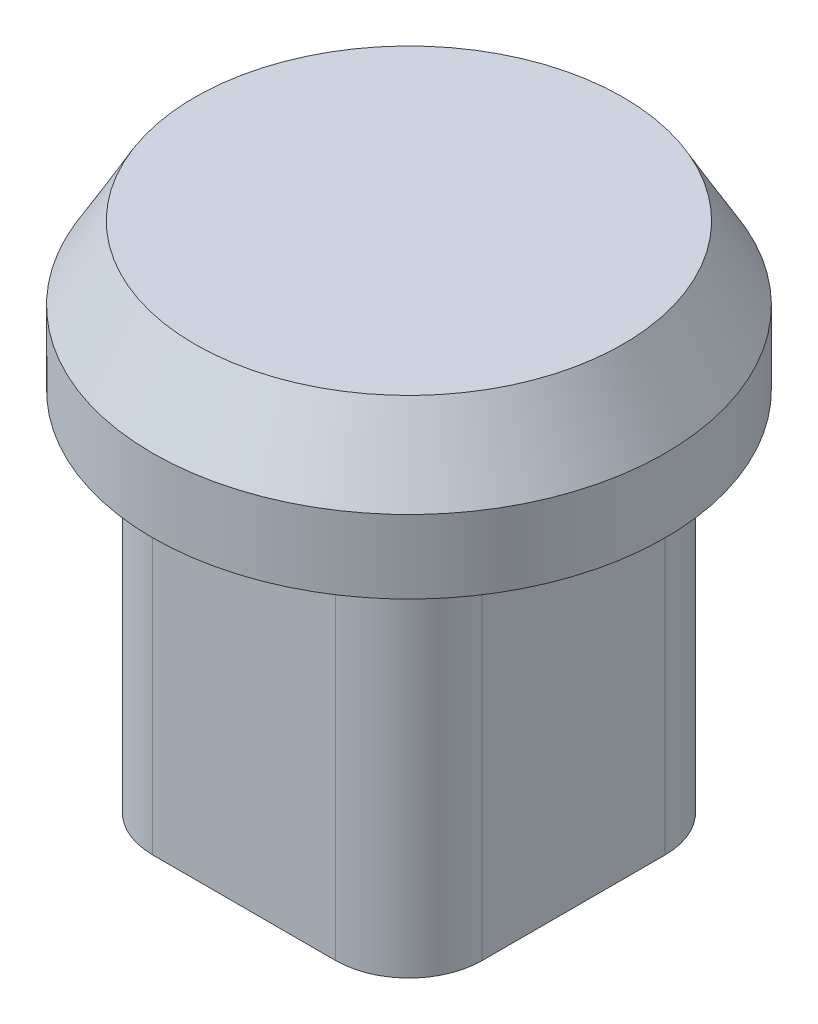
ISO-10303-21;
HEADER;
FILE_DESCRIPTION(('STEP AP214'),'2;1');
FILE_NAME('part.step','',(''),(''),'','','');
FILE_SCHEMA(('AUTOMOTIVE_DESIGN { 1 0 10303 214 1 1 1 1 }'));
ENDSEC;
DATA;
#1=APPLICATION_CONTEXT('core data for automotive mechanical design processes');
#2=APPLICATION_PROTOCOL_DEFINITION('international standard','automotive_design',2000,#1);
#3=PRODUCT_CONTEXT('',#1,'mechanical');
#4=PRODUCT('Part','Part','',(#3));
#5=PRODUCT_RELATED_PRODUCT_CATEGORY('part','',(#4));
#6=PRODUCT_DEFINITION_FORMATION('','',#4);
#7=PRODUCT_DEFINITION_CONTEXT('part definition',#1,'design');
#8=PRODUCT_DEFINITION('design','',#6,#7);
#9=PRODUCT_DEFINITION_SHAPE('','',#8);
#10=(LENGTH_UNIT() NAMED_UNIT(*) SI_UNIT(.MILLI.,.METRE.));
#11=(NAMED_UNIT(*) PLANE_ANGLE_UNIT() SI_UNIT($,.RADIAN.));
#12=(NAMED_UNIT(*) SI_UNIT($,.STERADIAN.) SOLID_ANGLE_UNIT());
#13=UNCERTAINTY_MEASURE_WITH_UNIT(LENGTH_MEASURE(1.E-05),#10,'distance_accuracy_value','');
#14=(GEOMETRIC_REPRESENTATION_CONTEXT(3) GLOBAL_UNCERTAINTY_ASSIGNED_CONTEXT((#13)) GLOBAL_UNIT_ASSIGNED_CONTEXT((#10,
#11,#12)) REPRESENTATION_CONTEXT('',''));
#15=CARTESIAN_POINT('',(0.,0.,0.));
#16=DIRECTION('',(0.,0.,1.));
#17=DIRECTION('',(1.,0.,0.));
#18=AXIS2_PLACEMENT_3D('',#15,#16,#17);
#19=CARTESIAN_POINT('',(2.25,5.,2.25));
#20=DIRECTION('',(-1.,0.,0.));
#21=DIRECTION('',(0.,0.,1.));
#22=AXIS2_PLACEMENT_3D('',#19,#20,#21);
#23=PLANE('',#22);
#24=DIRECTION('',(0.,0.,-1.));
#25=VECTOR('',#24,1.);
#26=CARTESIAN_POINT('',(2.25,0.,2.25));
#27=LINE('',#26,#25);
#28=CARTESIAN_POINT('',(2.25,0.,1.25));
#29=VERTEX_POINT('',#28);
#30=CARTESIAN_POINT('',(2.25,0.,-1.25));
#31=VERTEX_POINT('',#30);
#32=EDGE_CURVE('E127',#29,#31,#27,.T.);
#33=ORIENTED_EDGE('',*,*,#32,.T.);
#34=DIRECTION('',(0.,-1.,0.));
#35=VECTOR('',#34,1.);
#36=CARTESIAN_POINT('',(2.25,5.,-1.25));
#37=LINE('',#36,#35);
#38=CARTESIAN_POINT('',(2.25,5.,-1.25));
#39=VERTEX_POINT('',#38);
#40=EDGE_CURVE('E105',#31,#39,#37,.F.);
#41=ORIENTED_EDGE('',*,*,#40,.T.);
#42=DIRECTION('',(0.,0.,-1.));
#43=VECTOR('',#42,1.);
#44=CARTESIAN_POINT('',(2.25,5.,2.25));
#45=LINE('',#44,#43);
#46=CARTESIAN_POINT('',(2.25,5.,1.25));
#47=VERTEX_POINT('',#46);
#48=EDGE_CURVE('E137',#47,#39,#45,.T.);
#49=ORIENTED_EDGE('',*,*,#48,.F.);
#50=DIRECTION('',(0.,-1.,0.));
#51=VECTOR('',#50,1.);
#52=CARTESIAN_POINT('',(2.25,5.,1.25));
#53=LINE('',#52,#51);
#54=EDGE_CURVE('E110',#47,#29,#53,.T.);
#55=ORIENTED_EDGE('',*,*,#54,.T.);
#56=EDGE_LOOP('',(#33,#41,#49,#55));
#57=FACE_BOUND('',#56,.T.);
#58=ADVANCED_FACE('F35',(#57),#23,.F.);
#59=CARTESIAN_POINT('',(-2.25,5.,-2.25));
#60=DIRECTION('',(0.,0.,1.));
#61=DIRECTION('',(1.,0.,0.));
#62=AXIS2_PLACEMENT_3D('',#59,#60,#61);
#63=PLANE('',#62);
#64=DIRECTION('',(-1.,0.,0.));
#65=VECTOR('',#64,1.);
#66=CARTESIAN_POINT('',(-2.25,5.,-2.25));
#67=LINE('',#66,#65);
#68=CARTESIAN_POINT('',(1.25,5.,-2.25));
#69=VERTEX_POINT('',#68);
#70=CARTESIAN_POINT('',(-1.25,5.,-2.25));
#71=VERTEX_POINT('',#70);
#72=EDGE_CURVE('E119',#69,#71,#67,.T.);
#73=ORIENTED_EDGE('',*,*,#72,.F.);
#74=DIRECTION('',(0.,-1.,0.));
#75=VECTOR('',#74,1.);
#76=CARTESIAN_POINT('',(1.25,5.,-2.25));
#77=LINE('',#76,#75);
#78=CARTESIAN_POINT('',(1.25,0.,-2.25));
#79=VERTEX_POINT('',#78);
#80=EDGE_CURVE('E104',#69,#79,#77,.T.);
#81=ORIENTED_EDGE('',*,*,#80,.T.);
#82=DIRECTION('',(-1.,0.,0.));
#83=VECTOR('',#82,1.);
#84=CARTESIAN_POINT('',(-2.25,0.,-2.25));
#85=LINE('',#84,#83);
#86=CARTESIAN_POINT('',(-1.25,0.,-2.25));
#87=VERTEX_POINT('',#86);
#88=EDGE_CURVE('E117',#79,#87,#85,.T.);
#89=ORIENTED_EDGE('',*,*,#88,.T.);
#90=DIRECTION('',(0.,-1.,0.));
#91=VECTOR('',#90,1.);
#92=CARTESIAN_POINT('',(-1.25,5.,-2.25));
#93=LINE('',#92,#91);
#94=EDGE_CURVE('E121',#87,#71,#93,.F.);
#95=ORIENTED_EDGE('',*,*,#94,.T.);
#96=EDGE_LOOP('',(#73,#81,#89,#95));
#97=FACE_BOUND('',#96,.T.);
#98=ADVANCED_FACE('F116',(#97),#63,.F.);
#99=CARTESIAN_POINT('',(-2.25,5.,2.25));
#100=DIRECTION('',(1.,0.,0.));
#101=DIRECTION('',(0.,0.,-1.));
#102=AXIS2_PLACEMENT_3D('',#99,#100,#101);
#103=PLANE('',#102);
#104=DIRECTION('',(0.,0.,1.));
#105=VECTOR('',#104,1.);
#106=CARTESIAN_POINT('',(-2.25,5.,2.25));
#107=LINE('',#106,#105);
#108=CARTESIAN_POINT('',(-2.25,5.,-1.25));
#109=VERTEX_POINT('',#108);
#110=CARTESIAN_POINT('',(-2.25,5.,1.25));
#111=VERTEX_POINT('',#110);
#112=EDGE_CURVE('E184',#109,#111,#107,.T.);
#113=ORIENTED_EDGE('',*,*,#112,.F.);
#114=DIRECTION('',(0.,-1.,0.));
#115=VECTOR('',#114,1.);
#116=CARTESIAN_POINT('',(-2.25,5.,-1.25));
#117=LINE('',#116,#115);
#118=CARTESIAN_POINT('',(-2.25,0.,-1.25));
#119=VERTEX_POINT('',#118);
#120=EDGE_CURVE('E158',#109,#119,#117,.T.);
#121=ORIENTED_EDGE('',*,*,#120,.T.);
#122=DIRECTION('',(0.,0.,1.));
#123=VECTOR('',#122,1.);
#124=CARTESIAN_POINT('',(-2.25,0.,2.25));
#125=LINE('',#124,#123);
#126=CARTESIAN_POINT('',(-2.25,0.,1.25));
#127=VERTEX_POINT('',#126);
#128=EDGE_CURVE('E126',#119,#127,#125,.T.);
#129=ORIENTED_EDGE('',*,*,#128,.T.);
#130=DIRECTION('',(0.,-1.,0.));
#131=VECTOR('',#130,1.);
#132=CARTESIAN_POINT('',(-2.25,5.,1.25));
#133=LINE('',#132,#131);
#134=EDGE_CURVE('E50',#127,#111,#133,.F.);
#135=ORIENTED_EDGE('',*,*,#134,.T.);
#136=EDGE_LOOP('',(#113,#121,#129,#135));
#137=FACE_BOUND('',#136,.T.);
#138=ADVANCED_FACE('F182',(#137),#103,.F.);
#139=CARTESIAN_POINT('',(-2.25,5.,2.25));
#140=DIRECTION('',(0.,0.,-1.));
#141=DIRECTION('',(-1.,0.,0.));
#142=AXIS2_PLACEMENT_3D('',#139,#140,#141);
#143=PLANE('',#142);
#144=DIRECTION('',(1.,0.,0.));
#145=VECTOR('',#144,1.);
#146=CARTESIAN_POINT('',(-2.25,0.,2.25));
#147=LINE('',#146,#145);
#148=CARTESIAN_POINT('',(-1.25,0.,2.25));
#149=VERTEX_POINT('',#148);
#150=CARTESIAN_POINT('',(1.25,0.,2.25));
#151=VERTEX_POINT('',#150);
#152=EDGE_CURVE('E129',#149,#151,#147,.T.);
#153=ORIENTED_EDGE('',*,*,#152,.T.);
#154=DIRECTION('',(0.,-1.,0.));
#155=VECTOR('',#154,1.);
#156=CARTESIAN_POINT('',(1.25,5.,2.25));
#157=LINE('',#156,#155);
#158=CARTESIAN_POINT('',(1.25,5.,2.25));
#159=VERTEX_POINT('',#158);
#160=EDGE_CURVE('E155',#151,#159,#157,.F.);
#161=ORIENTED_EDGE('',*,*,#160,.T.);
#162=DIRECTION('',(1.,0.,0.));
#163=VECTOR('',#162,1.);
#164=CARTESIAN_POINT('',(-2.25,5.,2.25));
#165=LINE('',#164,#163);
#166=CARTESIAN_POINT('',(-1.25,5.,2.25));
#167=VERTEX_POINT('',#166);
#168=EDGE_CURVE('E142',#167,#159,#165,.T.);
#169=ORIENTED_EDGE('',*,*,#168,.F.);
#170=DIRECTION('',(0.,-1.,0.));
#171=VECTOR('',#170,1.);
#172=CARTESIAN_POINT('',(-1.25,5.,2.25));
#173=LINE('',#172,#171);
#174=EDGE_CURVE('E152',#167,#149,#173,.T.);
#175=ORIENTED_EDGE('',*,*,#174,.T.);
#176=EDGE_LOOP('',(#153,#161,#169,#175));
#177=FACE_BOUND('',#176,.T.);
#178=ADVANCED_FACE('F178',(#177),#143,.F.);
#179=CARTESIAN_POINT('',(0.,0.,0.));
#180=DIRECTION('',(0.,-1.,0.));
#181=DIRECTION('',(0.,0.,-1.));
#182=AXIS2_PLACEMENT_3D('',#179,#180,#181);
#183=PLANE('',#182);
#184=ORIENTED_EDGE('',*,*,#88,.F.);
#185=CARTESIAN_POINT('',(1.25,0.,-1.25));
#186=DIRECTION('',(0.,-1.,0.));
#187=DIRECTION('',(0.,0.,-1.));
#188=AXIS2_PLACEMENT_3D('',#185,#186,#187);
#189=CIRCLE('',#188,1.);
#190=EDGE_CURVE('E100',#79,#31,#189,.T.);
#191=ORIENTED_EDGE('',*,*,#190,.T.);
#192=ORIENTED_EDGE('',*,*,#32,.F.);
#193=CARTESIAN_POINT('',(1.25,0.,1.25));
#194=DIRECTION('',(0.,-1.,0.));
#195=DIRECTION('',(0.,0.,-1.));
#196=AXIS2_PLACEMENT_3D('',#193,#194,#195);
#197=CIRCLE('',#196,1.);
#198=EDGE_CURVE('E111',#29,#151,#197,.T.);
#199=ORIENTED_EDGE('',*,*,#198,.T.);
#200=ORIENTED_EDGE('',*,*,#152,.F.);
#201=CARTESIAN_POINT('',(-1.25,0.,1.25));
#202=DIRECTION('',(0.,-1.,0.));
#203=DIRECTION('',(0.,0.,-1.));
#204=AXIS2_PLACEMENT_3D('',#201,#202,#203);
#205=CIRCLE('',#204,1.);
#206=EDGE_CURVE('E120',#149,#127,#205,.T.);
#207=ORIENTED_EDGE('',*,*,#206,.T.);
#208=ORIENTED_EDGE('',*,*,#128,.F.);
#209=CARTESIAN_POINT('',(-1.25,0.,-1.25));
#210=DIRECTION('',(0.,-1.,0.));
#211=DIRECTION('',(0.,0.,-1.));
#212=AXIS2_PLACEMENT_3D('',#209,#210,#211);
#213=CIRCLE('',#212,1.);
#214=EDGE_CURVE('E125',#119,#87,#213,.T.);
#215=ORIENTED_EDGE('',*,*,#214,.T.);
#216=EDGE_LOOP('',(#184,#191,#192,#199,#200,#207,#208,#215));
#217=FACE_BOUND('',#216,.T.);
#218=ADVANCED_FACE('F123',(#217),#183,.T.);
#219=CARTESIAN_POINT('',(0.,5.,0.));
#220=DIRECTION('',(0.,1.,0.));
#221=DIRECTION('',(0.,0.,1.));
#222=AXIS2_PLACEMENT_3D('',#219,#220,#221);
#223=PLANE('',#222);
#224=CARTESIAN_POINT('',(0.,5.,0.));
#225=DIRECTION('',(0.,1.,0.));
#226=DIRECTION('',(0.,0.,1.));
#227=AXIS2_PLACEMENT_3D('',#224,#225,#226);
#228=CIRCLE('',#227,3.5);
#229=CARTESIAN_POINT('',(0.,5.,3.5));
#230=VERTEX_POINT('',#229);
#231=EDGE_CURVE('E131',#230,#230,#228,.T.);
#232=ORIENTED_EDGE('',*,*,#231,.F.);
#233=EDGE_LOOP('',(#232));
#234=FACE_BOUND('',#233,.T.);
#235=ORIENTED_EDGE('',*,*,#112,.T.);
#236=CARTESIAN_POINT('',(-1.25,5.,1.25));
#237=DIRECTION('',(0.,1.,0.));
#238=DIRECTION('',(0.,0.,1.));
#239=AXIS2_PLACEMENT_3D('',#236,#237,#238);
#240=CIRCLE('',#239,1.);
#241=EDGE_CURVE('E11',#111,#167,#240,.T.);
#242=ORIENTED_EDGE('',*,*,#241,.T.);
#243=ORIENTED_EDGE('',*,*,#168,.T.);
#244=CARTESIAN_POINT('',(1.25,5.,1.25));
#245=DIRECTION('',(0.,1.,0.));
#246=DIRECTION('',(0.,0.,1.));
#247=AXIS2_PLACEMENT_3D('',#244,#245,#246);
#248=CIRCLE('',#247,1.);
#249=EDGE_CURVE('E163',#159,#47,#248,.T.);
#250=ORIENTED_EDGE('',*,*,#249,.T.);
#251=ORIENTED_EDGE('',*,*,#48,.T.);
#252=CARTESIAN_POINT('',(1.25,5.,-1.25));
#253=DIRECTION('',(0.,1.,0.));
#254=DIRECTION('',(0.,0.,1.));
#255=AXIS2_PLACEMENT_3D('',#252,#253,#254);
#256=CIRCLE('',#255,1.);
#257=EDGE_CURVE('E161',#39,#69,#256,.T.);
#258=ORIENTED_EDGE('',*,*,#257,.T.);
#259=ORIENTED_EDGE('',*,*,#72,.T.);
#260=CARTESIAN_POINT('',(-1.25,5.,-1.25));
#261=DIRECTION('',(0.,1.,0.));
#262=DIRECTION('',(0.,0.,1.));
#263=AXIS2_PLACEMENT_3D('',#260,#261,#262);
#264=CIRCLE('',#263,1.);
#265=EDGE_CURVE('E43',#71,#109,#264,.T.);
#266=ORIENTED_EDGE('',*,*,#265,.T.);
#267=EDGE_LOOP('',(#235,#242,#243,#250,#251,#258,#259,#266));
#268=FACE_BOUND('',#267,.T.);
#269=ADVANCED_FACE('F168',(#234,#268),#223,.F.);
#270=CARTESIAN_POINT('',(0.,7.,0.));
#271=DIRECTION('',(0.,-1.,0.));
#272=DIRECTION('',(0.,0.,-1.));
#273=AXIS2_PLACEMENT_3D('',#270,#271,#272);
#274=CYLINDRICAL_SURFACE('',#273,3.5);
#275=CARTESIAN_POINT('',(0.,6.,0.));
#276=DIRECTION('',(0.,1.,0.));
#277=DIRECTION('',(0.,0.,1.));
#278=AXIS2_PLACEMENT_3D('',#275,#276,#277);
#279=CIRCLE('',#278,3.5);
#280=CARTESIAN_POINT('',(0.,6.,3.5));
#281=VERTEX_POINT('',#280);
#282=EDGE_CURVE('E141',#281,#281,#279,.F.);
#283=ORIENTED_EDGE('',*,*,#282,.T.);
#284=EDGE_LOOP('',(#283));
#285=FACE_BOUND('',#284,.T.);
#286=ORIENTED_EDGE('',*,*,#231,.T.);
#287=EDGE_LOOP('',(#286));
#288=FACE_BOUND('',#287,.T.);
#289=ADVANCED_FACE('F193',(#285,#288),#274,.T.);
#290=CARTESIAN_POINT('',(0.,7.,0.));
#291=DIRECTION('',(0.,1.,0.));
#292=DIRECTION('',(0.,0.,1.));
#293=AXIS2_PLACEMENT_3D('',#290,#291,#292);
#294=PLANE('',#293);
#295=CARTESIAN_POINT('',(0.,7.,0.));
#296=DIRECTION('',(0.,1.,0.));
#297=DIRECTION('',(0.,0.,1.));
#298=AXIS2_PLACEMENT_3D('',#295,#296,#297);
#299=CIRCLE('',#298,2.92264973081038);
#300=CARTESIAN_POINT('',(0.,7.,2.92264973081038));
#301=VERTEX_POINT('',#300);
#302=EDGE_CURVE('E138',#301,#301,#299,.T.);
#303=ORIENTED_EDGE('',*,*,#302,.T.);
#304=EDGE_LOOP('',(#303));
#305=FACE_BOUND('',#304,.T.);
#306=ADVANCED_FACE('F201',(#305),#294,.T.);
#307=CARTESIAN_POINT('',(0.,7.,0.));
#308=DIRECTION('',(0.,-1.,0.));
#309=DIRECTION('',(0.,0.,-1.));
#310=AXIS2_PLACEMENT_3D('',#307,#308,#309);
#311=CONICAL_SURFACE('',#310,2.92264973081038,0.523598775598296);
#312=ORIENTED_EDGE('',*,*,#282,.F.);
#313=EDGE_LOOP('',(#312));
#314=FACE_BOUND('',#313,.T.);
#315=ORIENTED_EDGE('',*,*,#302,.F.);
#316=EDGE_LOOP('',(#315));
#317=FACE_BOUND('',#316,.T.);
#318=ADVANCED_FACE('F215',(#314,#317),#311,.T.);
#319=CARTESIAN_POINT('',(1.25,5.,-1.25));
#320=DIRECTION('',(0.,-1.,0.));
#321=DIRECTION('',(0.,0.,-1.));
#322=AXIS2_PLACEMENT_3D('',#319,#320,#321);
#323=CYLINDRICAL_SURFACE('',#322,1.);
#324=ORIENTED_EDGE('',*,*,#257,.F.);
#325=ORIENTED_EDGE('',*,*,#40,.F.);
#326=ORIENTED_EDGE('',*,*,#190,.F.);
#327=ORIENTED_EDGE('',*,*,#80,.F.);
#328=EDGE_LOOP('',(#324,#325,#326,#327));
#329=FACE_BOUND('',#328,.T.);
#330=ADVANCED_FACE('F103',(#329),#323,.T.);
#331=CARTESIAN_POINT('',(1.25,5.,1.25));
#332=DIRECTION('',(0.,-1.,0.));
#333=DIRECTION('',(0.,0.,-1.));
#334=AXIS2_PLACEMENT_3D('',#331,#332,#333);
#335=CYLINDRICAL_SURFACE('',#334,1.);
#336=ORIENTED_EDGE('',*,*,#249,.F.);
#337=ORIENTED_EDGE('',*,*,#160,.F.);
#338=ORIENTED_EDGE('',*,*,#198,.F.);
#339=ORIENTED_EDGE('',*,*,#54,.F.);
#340=EDGE_LOOP('',(#336,#337,#338,#339));
#341=FACE_BOUND('',#340,.T.);
#342=ADVANCED_FACE('F175',(#341),#335,.T.);
#343=CARTESIAN_POINT('',(-1.25,5.,-1.25));
#344=DIRECTION('',(0.,-1.,0.));
#345=DIRECTION('',(0.,0.,-1.));
#346=AXIS2_PLACEMENT_3D('',#343,#344,#345);
#347=CYLINDRICAL_SURFACE('',#346,1.);
#348=ORIENTED_EDGE('',*,*,#265,.F.);
#349=ORIENTED_EDGE('',*,*,#94,.F.);
#350=ORIENTED_EDGE('',*,*,#214,.F.);
#351=ORIENTED_EDGE('',*,*,#120,.F.);
#352=EDGE_LOOP('',(#348,#349,#350,#351));
#353=FACE_BOUND('',#352,.T.);
#354=ADVANCED_FACE('F186',(#353),#347,.T.);
#355=CARTESIAN_POINT('',(-1.25,5.,1.25));
#356=DIRECTION('',(0.,-1.,0.));
#357=DIRECTION('',(0.,0.,-1.));
#358=AXIS2_PLACEMENT_3D('',#355,#356,#357);
#359=CYLINDRICAL_SURFACE('',#358,1.);
#360=ORIENTED_EDGE('',*,*,#241,.F.);
#361=ORIENTED_EDGE('',*,*,#134,.F.);
#362=ORIENTED_EDGE('',*,*,#206,.F.);
#363=ORIENTED_EDGE('',*,*,#174,.F.);
#364=EDGE_LOOP('',(#360,#361,#362,#363));
#365=FACE_BOUND('',#364,.T.);
#366=ADVANCED_FACE('F37',(#365),#359,.T.);
#367=CLOSED_SHELL('',(#58,#98,#138,#178,#218,#269,#289,#306,#318,#330,#342,#354,#366));
#368=MANIFOLD_SOLID_BREP('B2',#367);
#369=ADVANCED_BREP_SHAPE_REPRESENTATION('',(#18,#368),#14);
#370=SHAPE_DEFINITION_REPRESENTATION(#9,#369);
ENDSEC;
END-ISO-10303-21;
